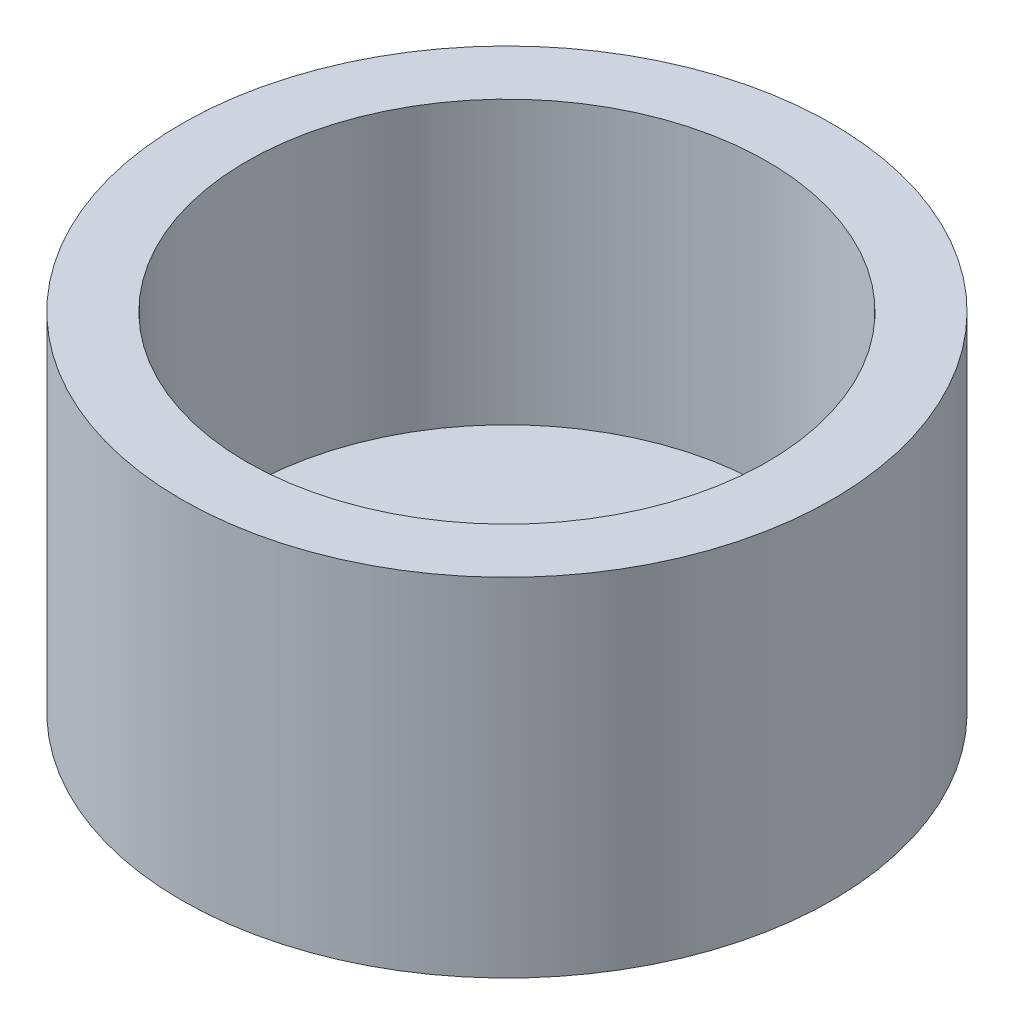
ISO-10303-21;
HEADER;
FILE_DESCRIPTION(('STEP AP214'),'2;1');
FILE_NAME('part.step','',(''),(''),'','','');
FILE_SCHEMA(('AUTOMOTIVE_DESIGN { 1 0 10303 214 1 1 1 1 }'));
ENDSEC;
DATA;
#1=APPLICATION_CONTEXT('core data for automotive mechanical design processes');
#2=APPLICATION_PROTOCOL_DEFINITION('international standard','automotive_design',2000,#1);
#3=PRODUCT_CONTEXT('',#1,'mechanical');
#4=PRODUCT('Part','Part','',(#3));
#5=PRODUCT_RELATED_PRODUCT_CATEGORY('part','',(#4));
#6=PRODUCT_DEFINITION_FORMATION('','',#4);
#7=PRODUCT_DEFINITION_CONTEXT('part definition',#1,'design');
#8=PRODUCT_DEFINITION('design','',#6,#7);
#9=PRODUCT_DEFINITION_SHAPE('','',#8);
#10=(LENGTH_UNIT() NAMED_UNIT(*) SI_UNIT(.MILLI.,.METRE.));
#11=(NAMED_UNIT(*) PLANE_ANGLE_UNIT() SI_UNIT($,.RADIAN.));
#12=(NAMED_UNIT(*) SI_UNIT($,.STERADIAN.) SOLID_ANGLE_UNIT());
#13=UNCERTAINTY_MEASURE_WITH_UNIT(LENGTH_MEASURE(1.E-05),#10,'distance_accuracy_value','');
#14=(GEOMETRIC_REPRESENTATION_CONTEXT(3) GLOBAL_UNCERTAINTY_ASSIGNED_CONTEXT((#13)) GLOBAL_UNIT_ASSIGNED_CONTEXT((#10,
#11,#12)) REPRESENTATION_CONTEXT('',''));
#15=CARTESIAN_POINT('',(0.,0.,0.));
#16=DIRECTION('',(0.,0.,1.));
#17=DIRECTION('',(1.,0.,0.));
#18=AXIS2_PLACEMENT_3D('',#15,#16,#17);
#19=CARTESIAN_POINT('',(0.,80.,0.));
#20=DIRECTION('',(0.,-1.,0.));
#21=DIRECTION('',(0.,0.,-1.));
#22=AXIS2_PLACEMENT_3D('',#19,#20,#21);
#23=CYLINDRICAL_SURFACE('',#22,75.);
#24=CARTESIAN_POINT('',(0.,80.,0.));
#25=DIRECTION('',(0.,1.,0.));
#26=DIRECTION('',(0.,0.,1.));
#27=AXIS2_PLACEMENT_3D('',#24,#25,#26);
#28=CIRCLE('',#27,75.);
#29=CARTESIAN_POINT('',(0.,80.,75.));
#30=VERTEX_POINT('',#29);
#31=EDGE_CURVE('E10',#30,#30,#28,.T.);
#32=ORIENTED_EDGE('',*,*,#31,.F.);
#33=EDGE_LOOP('',(#32));
#34=FACE_BOUND('',#33,.T.);
#35=CARTESIAN_POINT('',(0.,0.,0.));
#36=DIRECTION('',(0.,1.,0.));
#37=DIRECTION('',(0.,0.,1.));
#38=AXIS2_PLACEMENT_3D('',#35,#36,#37);
#39=CIRCLE('',#38,75.);
#40=CARTESIAN_POINT('',(0.,0.,75.));
#41=VERTEX_POINT('',#40);
#42=EDGE_CURVE('E41',#41,#41,#39,.T.);
#43=ORIENTED_EDGE('',*,*,#42,.T.);
#44=EDGE_LOOP('',(#43));
#45=FACE_BOUND('',#44,.T.);
#46=ADVANCED_FACE('F38',(#34,#45),#23,.T.);
#47=CARTESIAN_POINT('',(0.,80.,0.));
#48=DIRECTION('',(0.,1.,0.));
#49=DIRECTION('',(0.,0.,1.));
#50=AXIS2_PLACEMENT_3D('',#47,#48,#49);
#51=PLANE('',#50);
#52=CARTESIAN_POINT('',(0.,80.,0.));
#53=DIRECTION('',(0.,1.,0.));
#54=DIRECTION('',(0.,0.,1.));
#55=AXIS2_PLACEMENT_3D('',#52,#53,#54);
#56=CIRCLE('',#55,60.);
#57=CARTESIAN_POINT('',(0.,80.,60.));
#58=VERTEX_POINT('',#57);
#59=EDGE_CURVE('E48',#58,#58,#56,.T.);
#60=ORIENTED_EDGE('',*,*,#59,.F.);
#61=EDGE_LOOP('',(#60));
#62=FACE_BOUND('',#61,.T.);
#63=ORIENTED_EDGE('',*,*,#31,.T.);
#64=EDGE_LOOP('',(#63));
#65=FACE_BOUND('',#64,.T.);
#66=ADVANCED_FACE('F68',(#62,#65),#51,.T.);
#67=CARTESIAN_POINT('',(0.,0.,0.));
#68=DIRECTION('',(0.,1.,0.));
#69=DIRECTION('',(0.,0.,1.));
#70=AXIS2_PLACEMENT_3D('',#67,#68,#69);
#71=PLANE('',#70);
#72=ORIENTED_EDGE('',*,*,#42,.F.);
#73=EDGE_LOOP('',(#72));
#74=FACE_BOUND('',#73,.T.);
#75=ADVANCED_FACE('F60',(#74),#71,.F.);
#76=CARTESIAN_POINT('',(0.,80.,0.));
#77=DIRECTION('',(0.,-1.,0.));
#78=DIRECTION('',(0.,0.,-1.));
#79=AXIS2_PLACEMENT_3D('',#76,#77,#78);
#80=CYLINDRICAL_SURFACE('',#79,60.);
#81=ORIENTED_EDGE('',*,*,#59,.T.);
#82=EDGE_LOOP('',(#81));
#83=FACE_BOUND('',#82,.T.);
#84=CARTESIAN_POINT('',(0.,15.,0.));
#85=DIRECTION('',(0.,1.,0.));
#86=DIRECTION('',(0.,0.,1.));
#87=AXIS2_PLACEMENT_3D('',#84,#85,#86);
#88=CIRCLE('',#87,60.);
#89=CARTESIAN_POINT('',(0.,15.,60.));
#90=VERTEX_POINT('',#89);
#91=EDGE_CURVE('E52',#90,#90,#88,.T.);
#92=ORIENTED_EDGE('',*,*,#91,.F.);
#93=EDGE_LOOP('',(#92));
#94=FACE_BOUND('',#93,.T.);
#95=ADVANCED_FACE('F58',(#83,#94),#80,.F.);
#96=CARTESIAN_POINT('',(0.,15.,0.));
#97=DIRECTION('',(0.,1.,0.));
#98=DIRECTION('',(0.,0.,1.));
#99=AXIS2_PLACEMENT_3D('',#96,#97,#98);
#100=PLANE('',#99);
#101=ORIENTED_EDGE('',*,*,#91,.T.);
#102=EDGE_LOOP('',(#101));
#103=FACE_BOUND('',#102,.T.);
#104=ADVANCED_FACE('F56',(#103),#100,.T.);
#105=CLOSED_SHELL('',(#46,#66,#75,#95,#104));
#106=MANIFOLD_SOLID_BREP('B2',#105);
#107=ADVANCED_BREP_SHAPE_REPRESENTATION('',(#18,#106),#14);
#108=SHAPE_DEFINITION_REPRESENTATION(#9,#107);
ENDSEC;
END-ISO-10303-21;
